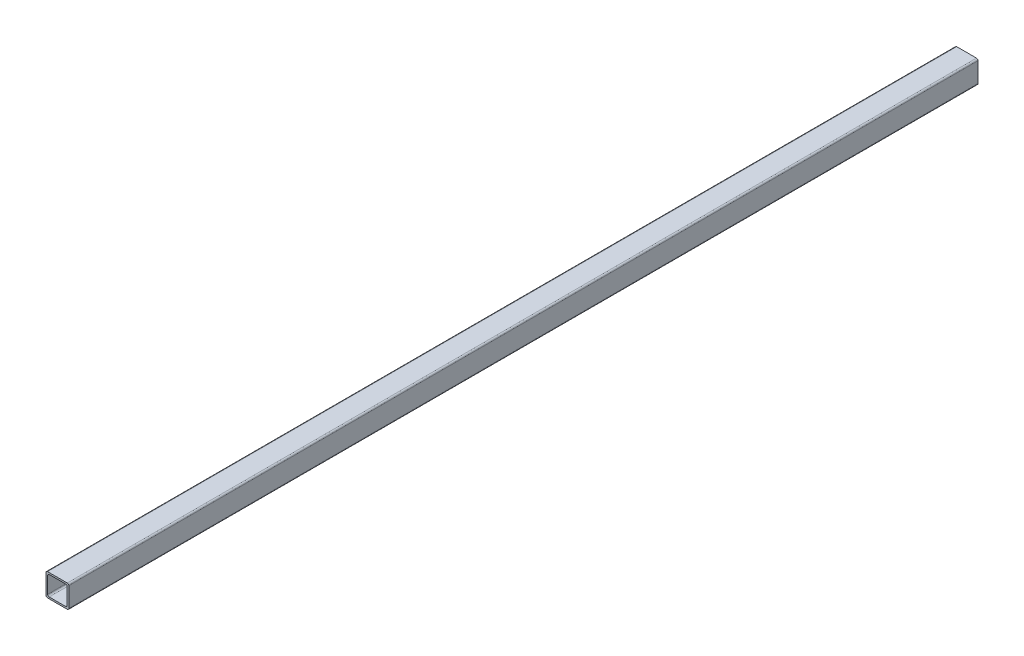
ISO-10303-21;
HEADER;
FILE_DESCRIPTION(('STEP AP214'),'2;1');
FILE_NAME('part.step','',(''),(''),'','','');
FILE_SCHEMA(('AUTOMOTIVE_DESIGN { 1 0 10303 214 1 1 1 1 }'));
ENDSEC;
DATA;
#1=APPLICATION_CONTEXT('core data for automotive mechanical design processes');
#2=APPLICATION_PROTOCOL_DEFINITION('international standard','automotive_design',2000,#1);
#3=PRODUCT_CONTEXT('',#1,'mechanical');
#4=PRODUCT('Part','Part','',(#3));
#5=PRODUCT_RELATED_PRODUCT_CATEGORY('part','',(#4));
#6=PRODUCT_DEFINITION_FORMATION('','',#4);
#7=PRODUCT_DEFINITION_CONTEXT('part definition',#1,'design');
#8=PRODUCT_DEFINITION('design','',#6,#7);
#9=PRODUCT_DEFINITION_SHAPE('','',#8);
#10=(LENGTH_UNIT() NAMED_UNIT(*) SI_UNIT(.MILLI.,.METRE.));
#11=(NAMED_UNIT(*) PLANE_ANGLE_UNIT() SI_UNIT($,.RADIAN.));
#12=(NAMED_UNIT(*) SI_UNIT($,.STERADIAN.) SOLID_ANGLE_UNIT());
#13=UNCERTAINTY_MEASURE_WITH_UNIT(LENGTH_MEASURE(1.E-05),#10,'distance_accuracy_value','');
#14=(GEOMETRIC_REPRESENTATION_CONTEXT(3) GLOBAL_UNCERTAINTY_ASSIGNED_CONTEXT((#13)) GLOBAL_UNIT_ASSIGNED_CONTEXT((#10,
#11,#12)) REPRESENTATION_CONTEXT('',''));
#15=CARTESIAN_POINT('',(0.,0.,0.));
#16=DIRECTION('',(0.,0.,1.));
#17=DIRECTION('',(1.,0.,0.));
#18=AXIS2_PLACEMENT_3D('',#15,#16,#17);
#19=CARTESIAN_POINT('',(2.54,-35.56,1520.));
#20=DIRECTION('',(0.,0.,1.));
#21=DIRECTION('',(1.,0.,0.));
#22=AXIS2_PLACEMENT_3D('',#19,#20,#21);
#23=PLANE('',#22);
#24=CARTESIAN_POINT('',(2.54,-35.56,1520.));
#25=DIRECTION('',(0.,0.,1.));
#26=DIRECTION('',(1.,0.,0.));
#27=AXIS2_PLACEMENT_3D('',#24,#25,#26);
#28=CIRCLE('',#27,2.54);
#29=CARTESIAN_POINT('',(0.,-35.56,1520.));
#30=VERTEX_POINT('',#29);
#31=CARTESIAN_POINT('',(2.54000000000002,-38.1,1520.));
#32=VERTEX_POINT('',#31);
#33=EDGE_CURVE('E211',#30,#32,#28,.T.);
#34=ORIENTED_EDGE('',*,*,#33,.T.);
#35=DIRECTION('',(1.,0.,0.));
#36=VECTOR('',#35,1.);
#37=CARTESIAN_POINT('',(2.54000000000002,-38.1,1520.));
#38=LINE('',#37,#36);
#39=CARTESIAN_POINT('',(35.56,-38.1,1520.));
#40=VERTEX_POINT('',#39);
#41=EDGE_CURVE('E214',#32,#40,#38,.T.);
#42=ORIENTED_EDGE('',*,*,#41,.T.);
#43=CARTESIAN_POINT('',(35.56,-35.56,1520.));
#44=DIRECTION('',(0.,0.,1.));
#45=DIRECTION('',(-1.,0.,0.));
#46=AXIS2_PLACEMENT_3D('',#43,#44,#45);
#47=CIRCLE('',#46,2.54);
#48=CARTESIAN_POINT('',(38.1,-35.56,1520.));
#49=VERTEX_POINT('',#48);
#50=EDGE_CURVE('E217',#40,#49,#47,.T.);
#51=ORIENTED_EDGE('',*,*,#50,.T.);
#52=DIRECTION('',(0.,1.,0.));
#53=VECTOR('',#52,1.);
#54=CARTESIAN_POINT('',(38.1,-2.54000000000002,1520.));
#55=LINE('',#54,#53);
#56=CARTESIAN_POINT('',(38.1,-2.54000000000002,1520.));
#57=VERTEX_POINT('',#56);
#58=EDGE_CURVE('E219',#49,#57,#55,.T.);
#59=ORIENTED_EDGE('',*,*,#58,.T.);
#60=CARTESIAN_POINT('',(35.56,-2.54,1520.));
#61=DIRECTION('',(0.,0.,1.));
#62=DIRECTION('',(1.,0.,0.));
#63=AXIS2_PLACEMENT_3D('',#60,#61,#62);
#64=CIRCLE('',#63,2.54);
#65=CARTESIAN_POINT('',(35.56,0.,1520.));
#66=VERTEX_POINT('',#65);
#67=EDGE_CURVE('E221',#57,#66,#64,.T.);
#68=ORIENTED_EDGE('',*,*,#67,.T.);
#69=DIRECTION('',(-1.,0.,0.));
#70=VECTOR('',#69,1.);
#71=CARTESIAN_POINT('',(2.54000000000002,0.,1520.));
#72=LINE('',#71,#70);
#73=CARTESIAN_POINT('',(2.54000000000002,0.,1520.));
#74=VERTEX_POINT('',#73);
#75=EDGE_CURVE('E223',#66,#74,#72,.T.);
#76=ORIENTED_EDGE('',*,*,#75,.T.);
#77=CARTESIAN_POINT('',(2.54,-2.54,1520.));
#78=DIRECTION('',(0.,0.,1.));
#79=DIRECTION('',(-1.,0.,0.));
#80=AXIS2_PLACEMENT_3D('',#77,#78,#79);
#81=CIRCLE('',#80,2.54);
#82=CARTESIAN_POINT('',(0.,-2.54000000000002,1520.));
#83=VERTEX_POINT('',#82);
#84=EDGE_CURVE('E225',#74,#83,#81,.T.);
#85=ORIENTED_EDGE('',*,*,#84,.T.);
#86=DIRECTION('',(0.,-1.,0.));
#87=VECTOR('',#86,1.);
#88=CARTESIAN_POINT('',(0.,-2.54000000000002,1520.));
#89=LINE('',#88,#87);
#90=EDGE_CURVE('E227',#83,#30,#89,.T.);
#91=ORIENTED_EDGE('',*,*,#90,.T.);
#92=EDGE_LOOP('',(#34,#42,#51,#59,#68,#76,#85,#91));
#93=FACE_BOUND('',#92,.T.);
#94=DIRECTION('',(1.,0.,0.));
#95=VECTOR('',#94,1.);
#96=CARTESIAN_POINT('',(5.30860000000002,-35.3314,1520.));
#97=LINE('',#96,#95);
#98=CARTESIAN_POINT('',(5.30860000000002,-35.3314,1520.));
#99=VERTEX_POINT('',#98);
#100=CARTESIAN_POINT('',(32.7914,-35.3314,1520.));
#101=VERTEX_POINT('',#100);
#102=EDGE_CURVE('E154',#99,#101,#97,.T.);
#103=ORIENTED_EDGE('',*,*,#102,.F.);
#104=CARTESIAN_POINT('',(5.3086,-32.7914,1520.));
#105=DIRECTION('',(0.,0.,1.));
#106=DIRECTION('',(1.,0.,0.));
#107=AXIS2_PLACEMENT_3D('',#104,#105,#106);
#108=CIRCLE('',#107,2.54);
#109=CARTESIAN_POINT('',(2.7686,-32.7914,1520.));
#110=VERTEX_POINT('',#109);
#111=EDGE_CURVE('E146',#110,#99,#108,.T.);
#112=ORIENTED_EDGE('',*,*,#111,.F.);
#113=DIRECTION('',(0.,-1.,0.));
#114=VECTOR('',#113,1.);
#115=CARTESIAN_POINT('',(2.7686,-5.30860000000002,1520.));
#116=LINE('',#115,#114);
#117=CARTESIAN_POINT('',(2.7686,-5.30860000000002,1520.));
#118=VERTEX_POINT('',#117);
#119=EDGE_CURVE('E179',#118,#110,#116,.T.);
#120=ORIENTED_EDGE('',*,*,#119,.F.);
#121=CARTESIAN_POINT('',(5.3086,-5.3086,1520.));
#122=DIRECTION('',(0.,0.,1.));
#123=DIRECTION('',(1.,0.,0.));
#124=AXIS2_PLACEMENT_3D('',#121,#122,#123);
#125=CIRCLE('',#124,2.54);
#126=CARTESIAN_POINT('',(5.30860000000002,-2.7686,1520.));
#127=VERTEX_POINT('',#126);
#128=EDGE_CURVE('E177',#127,#118,#125,.T.);
#129=ORIENTED_EDGE('',*,*,#128,.F.);
#130=DIRECTION('',(-1.,0.,0.));
#131=VECTOR('',#130,1.);
#132=CARTESIAN_POINT('',(5.30860000000002,-2.7686,1520.));
#133=LINE('',#132,#131);
#134=CARTESIAN_POINT('',(32.7914,-2.7686,1520.));
#135=VERTEX_POINT('',#134);
#136=EDGE_CURVE('E175',#135,#127,#133,.T.);
#137=ORIENTED_EDGE('',*,*,#136,.F.);
#138=CARTESIAN_POINT('',(32.7914,-5.3086,1520.));
#139=DIRECTION('',(0.,0.,1.));
#140=DIRECTION('',(1.,0.,0.));
#141=AXIS2_PLACEMENT_3D('',#138,#139,#140);
#142=CIRCLE('',#141,2.54);
#143=CARTESIAN_POINT('',(35.3314,-5.30860000000002,1520.));
#144=VERTEX_POINT('',#143);
#145=EDGE_CURVE('E173',#144,#135,#142,.T.);
#146=ORIENTED_EDGE('',*,*,#145,.F.);
#147=DIRECTION('',(0.,1.,0.));
#148=VECTOR('',#147,1.);
#149=CARTESIAN_POINT('',(35.3314,-5.30860000000002,1520.));
#150=LINE('',#149,#148);
#151=CARTESIAN_POINT('',(35.3314,-32.7914,1520.));
#152=VERTEX_POINT('',#151);
#153=EDGE_CURVE('E169',#152,#144,#150,.T.);
#154=ORIENTED_EDGE('',*,*,#153,.F.);
#155=CARTESIAN_POINT('',(32.7914,-32.7914,1520.));
#156=DIRECTION('',(0.,0.,1.));
#157=DIRECTION('',(1.,0.,0.));
#158=AXIS2_PLACEMENT_3D('',#155,#156,#157);
#159=CIRCLE('',#158,2.54);
#160=EDGE_CURVE('E167',#101,#152,#159,.T.);
#161=ORIENTED_EDGE('',*,*,#160,.F.);
#162=EDGE_LOOP('',(#103,#112,#120,#129,#137,#146,#154,#161));
#163=FACE_BOUND('',#162,.T.);
#164=ADVANCED_FACE('F33',(#93,#163),#23,.T.);
#165=CARTESIAN_POINT('',(2.54,-35.56,0.));
#166=DIRECTION('',(0.,0.,1.));
#167=DIRECTION('',(1.,0.,0.));
#168=AXIS2_PLACEMENT_3D('',#165,#166,#167);
#169=PLANE('',#168);
#170=CARTESIAN_POINT('',(2.54,-35.56,0.));
#171=DIRECTION('',(0.,0.,1.));
#172=DIRECTION('',(1.,0.,0.));
#173=AXIS2_PLACEMENT_3D('',#170,#171,#172);
#174=CIRCLE('',#173,2.54);
#175=CARTESIAN_POINT('',(0.,-35.56,0.));
#176=VERTEX_POINT('',#175);
#177=CARTESIAN_POINT('',(2.54000000000002,-38.1,0.));
#178=VERTEX_POINT('',#177);
#179=EDGE_CURVE('E162',#176,#178,#174,.T.);
#180=ORIENTED_EDGE('',*,*,#179,.F.);
#181=DIRECTION('',(0.,-1.,0.));
#182=VECTOR('',#181,1.);
#183=CARTESIAN_POINT('',(0.,-2.54000000000002,0.));
#184=LINE('',#183,#182);
#185=CARTESIAN_POINT('',(0.,-2.54000000000002,0.));
#186=VERTEX_POINT('',#185);
#187=EDGE_CURVE('E215',#186,#176,#184,.T.);
#188=ORIENTED_EDGE('',*,*,#187,.F.);
#189=CARTESIAN_POINT('',(2.54,-2.54,0.));
#190=DIRECTION('',(0.,0.,1.));
#191=DIRECTION('',(-1.,0.,0.));
#192=AXIS2_PLACEMENT_3D('',#189,#190,#191);
#193=CIRCLE('',#192,2.54);
#194=CARTESIAN_POINT('',(2.54000000000002,0.,0.));
#195=VERTEX_POINT('',#194);
#196=EDGE_CURVE('E242',#195,#186,#193,.T.);
#197=ORIENTED_EDGE('',*,*,#196,.F.);
#198=DIRECTION('',(-1.,0.,0.));
#199=VECTOR('',#198,1.);
#200=CARTESIAN_POINT('',(2.54000000000002,0.,0.));
#201=LINE('',#200,#199);
#202=CARTESIAN_POINT('',(35.56,0.,0.));
#203=VERTEX_POINT('',#202);
#204=EDGE_CURVE('E240',#203,#195,#201,.T.);
#205=ORIENTED_EDGE('',*,*,#204,.F.);
#206=CARTESIAN_POINT('',(35.56,-2.54,0.));
#207=DIRECTION('',(0.,0.,1.));
#208=DIRECTION('',(1.,0.,0.));
#209=AXIS2_PLACEMENT_3D('',#206,#207,#208);
#210=CIRCLE('',#209,2.54);
#211=CARTESIAN_POINT('',(38.1,-2.54000000000002,0.));
#212=VERTEX_POINT('',#211);
#213=EDGE_CURVE('E238',#212,#203,#210,.T.);
#214=ORIENTED_EDGE('',*,*,#213,.F.);
#215=DIRECTION('',(0.,1.,0.));
#216=VECTOR('',#215,1.);
#217=CARTESIAN_POINT('',(38.1,-2.54000000000002,0.));
#218=LINE('',#217,#216);
#219=CARTESIAN_POINT('',(38.1,-35.56,0.));
#220=VERTEX_POINT('',#219);
#221=EDGE_CURVE('E236',#220,#212,#218,.T.);
#222=ORIENTED_EDGE('',*,*,#221,.F.);
#223=CARTESIAN_POINT('',(35.56,-35.56,0.));
#224=DIRECTION('',(0.,0.,1.));
#225=DIRECTION('',(-1.,0.,0.));
#226=AXIS2_PLACEMENT_3D('',#223,#224,#225);
#227=CIRCLE('',#226,2.54);
#228=CARTESIAN_POINT('',(35.56,-38.1,0.));
#229=VERTEX_POINT('',#228);
#230=EDGE_CURVE('E234',#229,#220,#227,.T.);
#231=ORIENTED_EDGE('',*,*,#230,.F.);
#232=DIRECTION('',(1.,0.,0.));
#233=VECTOR('',#232,1.);
#234=CARTESIAN_POINT('',(2.54000000000002,-38.1,0.));
#235=LINE('',#234,#233);
#236=EDGE_CURVE('E232',#178,#229,#235,.T.);
#237=ORIENTED_EDGE('',*,*,#236,.F.);
#238=EDGE_LOOP('',(#180,#188,#197,#205,#214,#222,#231,#237));
#239=FACE_BOUND('',#238,.T.);
#240=CARTESIAN_POINT('',(5.3086,-32.7914,0.));
#241=DIRECTION('',(0.,0.,1.));
#242=DIRECTION('',(1.,0.,0.));
#243=AXIS2_PLACEMENT_3D('',#240,#241,#242);
#244=CIRCLE('',#243,2.54);
#245=CARTESIAN_POINT('',(2.7686,-32.7914,0.));
#246=VERTEX_POINT('',#245);
#247=CARTESIAN_POINT('',(5.30860000000002,-35.3314,0.));
#248=VERTEX_POINT('',#247);
#249=EDGE_CURVE('E56',#246,#248,#244,.T.);
#250=ORIENTED_EDGE('',*,*,#249,.T.);
#251=DIRECTION('',(1.,0.,0.));
#252=VECTOR('',#251,1.);
#253=CARTESIAN_POINT('',(5.30860000000002,-35.3314,0.));
#254=LINE('',#253,#252);
#255=CARTESIAN_POINT('',(32.7914,-35.3314,0.));
#256=VERTEX_POINT('',#255);
#257=EDGE_CURVE('E161',#248,#256,#254,.T.);
#258=ORIENTED_EDGE('',*,*,#257,.T.);
#259=CARTESIAN_POINT('',(32.7914,-32.7914,0.));
#260=DIRECTION('',(0.,0.,1.));
#261=DIRECTION('',(1.,0.,0.));
#262=AXIS2_PLACEMENT_3D('',#259,#260,#261);
#263=CIRCLE('',#262,2.54);
#264=CARTESIAN_POINT('',(35.3314,-32.7914,0.));
#265=VERTEX_POINT('',#264);
#266=EDGE_CURVE('E183',#256,#265,#263,.T.);
#267=ORIENTED_EDGE('',*,*,#266,.T.);
#268=DIRECTION('',(0.,1.,0.));
#269=VECTOR('',#268,1.);
#270=CARTESIAN_POINT('',(35.3314,-5.30860000000002,0.));
#271=LINE('',#270,#269);
#272=CARTESIAN_POINT('',(35.3314,-5.30860000000002,0.));
#273=VERTEX_POINT('',#272);
#274=EDGE_CURVE('E186',#265,#273,#271,.T.);
#275=ORIENTED_EDGE('',*,*,#274,.T.);
#276=CARTESIAN_POINT('',(32.7914,-5.3086,0.));
#277=DIRECTION('',(0.,0.,1.));
#278=DIRECTION('',(1.,0.,0.));
#279=AXIS2_PLACEMENT_3D('',#276,#277,#278);
#280=CIRCLE('',#279,2.54);
#281=CARTESIAN_POINT('',(32.7914,-2.7686,0.));
#282=VERTEX_POINT('',#281);
#283=EDGE_CURVE('E189',#273,#282,#280,.T.);
#284=ORIENTED_EDGE('',*,*,#283,.T.);
#285=DIRECTION('',(-1.,0.,0.));
#286=VECTOR('',#285,1.);
#287=CARTESIAN_POINT('',(5.30860000000002,-2.7686,0.));
#288=LINE('',#287,#286);
#289=CARTESIAN_POINT('',(5.30860000000002,-2.7686,0.));
#290=VERTEX_POINT('',#289);
#291=EDGE_CURVE('E192',#282,#290,#288,.T.);
#292=ORIENTED_EDGE('',*,*,#291,.T.);
#293=CARTESIAN_POINT('',(5.3086,-5.3086,0.));
#294=DIRECTION('',(0.,0.,1.));
#295=DIRECTION('',(1.,0.,0.));
#296=AXIS2_PLACEMENT_3D('',#293,#294,#295);
#297=CIRCLE('',#296,2.54);
#298=CARTESIAN_POINT('',(2.7686,-5.30860000000002,0.));
#299=VERTEX_POINT('',#298);
#300=EDGE_CURVE('E195',#290,#299,#297,.T.);
#301=ORIENTED_EDGE('',*,*,#300,.T.);
#302=DIRECTION('',(0.,-1.,0.));
#303=VECTOR('',#302,1.);
#304=CARTESIAN_POINT('',(2.7686,-5.30860000000002,0.));
#305=LINE('',#304,#303);
#306=EDGE_CURVE('E155',#299,#246,#305,.T.);
#307=ORIENTED_EDGE('',*,*,#306,.T.);
#308=EDGE_LOOP('',(#250,#258,#267,#275,#284,#292,#301,#307));
#309=FACE_BOUND('',#308,.T.);
#310=ADVANCED_FACE('F272',(#239,#309),#169,.F.);
#311=CARTESIAN_POINT('',(2.54,-35.56,1520.));
#312=DIRECTION('',(0.,0.,-1.));
#313=DIRECTION('',(-1.,0.,0.));
#314=AXIS2_PLACEMENT_3D('',#311,#312,#313);
#315=CYLINDRICAL_SURFACE('',#314,2.54);
#316=ORIENTED_EDGE('',*,*,#179,.T.);
#317=DIRECTION('',(0.,0.,-1.));
#318=VECTOR('',#317,1.);
#319=CARTESIAN_POINT('',(2.54000000000002,-38.1,1520.));
#320=LINE('',#319,#318);
#321=EDGE_CURVE('E11',#32,#178,#320,.T.);
#322=ORIENTED_EDGE('',*,*,#321,.F.);
#323=ORIENTED_EDGE('',*,*,#33,.F.);
#324=DIRECTION('',(0.,0.,-1.));
#325=VECTOR('',#324,1.);
#326=CARTESIAN_POINT('',(0.,-35.56,1520.));
#327=LINE('',#326,#325);
#328=EDGE_CURVE('E229',#30,#176,#327,.T.);
#329=ORIENTED_EDGE('',*,*,#328,.T.);
#330=EDGE_LOOP('',(#316,#322,#323,#329));
#331=FACE_BOUND('',#330,.T.);
#332=ADVANCED_FACE('F35',(#331),#315,.T.);
#333=CARTESIAN_POINT('',(2.54000000000002,-38.1,1520.));
#334=DIRECTION('',(0.,1.,0.));
#335=DIRECTION('',(0.,0.,1.));
#336=AXIS2_PLACEMENT_3D('',#333,#334,#335);
#337=PLANE('',#336);
#338=ORIENTED_EDGE('',*,*,#236,.T.);
#339=DIRECTION('',(0.,0.,-1.));
#340=VECTOR('',#339,1.);
#341=CARTESIAN_POINT('',(35.56,-38.1,1520.));
#342=LINE('',#341,#340);
#343=EDGE_CURVE('E41',#40,#229,#342,.T.);
#344=ORIENTED_EDGE('',*,*,#343,.F.);
#345=ORIENTED_EDGE('',*,*,#41,.F.);
#346=ORIENTED_EDGE('',*,*,#321,.T.);
#347=EDGE_LOOP('',(#338,#344,#345,#346));
#348=FACE_BOUND('',#347,.T.);
#349=ADVANCED_FACE('F289',(#348),#337,.F.);
#350=CARTESIAN_POINT('',(35.56,-35.56,1520.));
#351=DIRECTION('',(0.,0.,-1.));
#352=DIRECTION('',(-1.,0.,0.));
#353=AXIS2_PLACEMENT_3D('',#350,#351,#352);
#354=CYLINDRICAL_SURFACE('',#353,2.54);
#355=ORIENTED_EDGE('',*,*,#230,.T.);
#356=DIRECTION('',(0.,0.,-1.));
#357=VECTOR('',#356,1.);
#358=CARTESIAN_POINT('',(38.1,-35.56,1520.));
#359=LINE('',#358,#357);
#360=EDGE_CURVE('E259',#49,#220,#359,.T.);
#361=ORIENTED_EDGE('',*,*,#360,.F.);
#362=ORIENTED_EDGE('',*,*,#50,.F.);
#363=ORIENTED_EDGE('',*,*,#343,.T.);
#364=EDGE_LOOP('',(#355,#361,#362,#363));
#365=FACE_BOUND('',#364,.T.);
#366=ADVANCED_FACE('F266',(#365),#354,.T.);
#367=CARTESIAN_POINT('',(38.1,-2.54000000000002,1520.));
#368=DIRECTION('',(-1.,0.,0.));
#369=DIRECTION('',(0.,-1.,0.));
#370=AXIS2_PLACEMENT_3D('',#367,#368,#369);
#371=PLANE('',#370);
#372=ORIENTED_EDGE('',*,*,#221,.T.);
#373=DIRECTION('',(0.,0.,-1.));
#374=VECTOR('',#373,1.);
#375=CARTESIAN_POINT('',(38.1,-2.54000000000002,1520.));
#376=LINE('',#375,#374);
#377=EDGE_CURVE('E256',#57,#212,#376,.T.);
#378=ORIENTED_EDGE('',*,*,#377,.F.);
#379=ORIENTED_EDGE('',*,*,#58,.F.);
#380=ORIENTED_EDGE('',*,*,#360,.T.);
#381=EDGE_LOOP('',(#372,#378,#379,#380));
#382=FACE_BOUND('',#381,.T.);
#383=ADVANCED_FACE('F278',(#382),#371,.F.);
#384=CARTESIAN_POINT('',(35.56,-2.54,1520.));
#385=DIRECTION('',(0.,0.,-1.));
#386=DIRECTION('',(-1.,0.,0.));
#387=AXIS2_PLACEMENT_3D('',#384,#385,#386);
#388=CYLINDRICAL_SURFACE('',#387,2.54);
#389=ORIENTED_EDGE('',*,*,#213,.T.);
#390=DIRECTION('',(0.,0.,-1.));
#391=VECTOR('',#390,1.);
#392=CARTESIAN_POINT('',(35.56,0.,1520.));
#393=LINE('',#392,#391);
#394=EDGE_CURVE('E253',#66,#203,#393,.T.);
#395=ORIENTED_EDGE('',*,*,#394,.F.);
#396=ORIENTED_EDGE('',*,*,#67,.F.);
#397=ORIENTED_EDGE('',*,*,#377,.T.);
#398=EDGE_LOOP('',(#389,#395,#396,#397));
#399=FACE_BOUND('',#398,.T.);
#400=ADVANCED_FACE('F282',(#399),#388,.T.);
#401=CARTESIAN_POINT('',(2.54000000000002,0.,1520.));
#402=DIRECTION('',(0.,-1.,0.));
#403=DIRECTION('',(0.,0.,-1.));
#404=AXIS2_PLACEMENT_3D('',#401,#402,#403);
#405=PLANE('',#404);
#406=ORIENTED_EDGE('',*,*,#204,.T.);
#407=DIRECTION('',(0.,0.,-1.));
#408=VECTOR('',#407,1.);
#409=CARTESIAN_POINT('',(2.54000000000002,0.,1520.));
#410=LINE('',#409,#408);
#411=EDGE_CURVE('E250',#74,#195,#410,.T.);
#412=ORIENTED_EDGE('',*,*,#411,.F.);
#413=ORIENTED_EDGE('',*,*,#75,.F.);
#414=ORIENTED_EDGE('',*,*,#394,.T.);
#415=EDGE_LOOP('',(#406,#412,#413,#414));
#416=FACE_BOUND('',#415,.T.);
#417=ADVANCED_FACE('F302',(#416),#405,.F.);
#418=CARTESIAN_POINT('',(2.54,-2.54,1520.));
#419=DIRECTION('',(0.,0.,-1.));
#420=DIRECTION('',(-1.,0.,0.));
#421=AXIS2_PLACEMENT_3D('',#418,#419,#420);
#422=CYLINDRICAL_SURFACE('',#421,2.54);
#423=ORIENTED_EDGE('',*,*,#196,.T.);
#424=DIRECTION('',(0.,0.,-1.));
#425=VECTOR('',#424,1.);
#426=CARTESIAN_POINT('',(0.,-2.54000000000002,1520.));
#427=LINE('',#426,#425);
#428=EDGE_CURVE('E247',#83,#186,#427,.T.);
#429=ORIENTED_EDGE('',*,*,#428,.F.);
#430=ORIENTED_EDGE('',*,*,#84,.F.);
#431=ORIENTED_EDGE('',*,*,#411,.T.);
#432=EDGE_LOOP('',(#423,#429,#430,#431));
#433=FACE_BOUND('',#432,.T.);
#434=ADVANCED_FACE('F300',(#433),#422,.T.);
#435=CARTESIAN_POINT('',(0.,-2.54000000000002,1520.));
#436=DIRECTION('',(1.,0.,0.));
#437=DIRECTION('',(0.,1.,0.));
#438=AXIS2_PLACEMENT_3D('',#435,#436,#437);
#439=PLANE('',#438);
#440=ORIENTED_EDGE('',*,*,#187,.T.);
#441=ORIENTED_EDGE('',*,*,#328,.F.);
#442=ORIENTED_EDGE('',*,*,#90,.F.);
#443=ORIENTED_EDGE('',*,*,#428,.T.);
#444=EDGE_LOOP('',(#440,#441,#442,#443));
#445=FACE_BOUND('',#444,.T.);
#446=ADVANCED_FACE('F295',(#445),#439,.F.);
#447=CARTESIAN_POINT('',(5.3086,-32.7914,1520.));
#448=DIRECTION('',(0.,0.,-1.));
#449=DIRECTION('',(-1.,0.,0.));
#450=AXIS2_PLACEMENT_3D('',#447,#448,#449);
#451=CYLINDRICAL_SURFACE('',#450,2.54);
#452=ORIENTED_EDGE('',*,*,#249,.F.);
#453=DIRECTION('',(0.,0.,-1.));
#454=VECTOR('',#453,1.);
#455=CARTESIAN_POINT('',(2.7686,-32.7914,1520.));
#456=LINE('',#455,#454);
#457=EDGE_CURVE('E150',#110,#246,#456,.T.);
#458=ORIENTED_EDGE('',*,*,#457,.F.);
#459=ORIENTED_EDGE('',*,*,#111,.T.);
#460=DIRECTION('',(0.,0.,-1.));
#461=VECTOR('',#460,1.);
#462=CARTESIAN_POINT('',(5.30860000000002,-35.3314,1520.));
#463=LINE('',#462,#461);
#464=EDGE_CURVE('E149',#99,#248,#463,.T.);
#465=ORIENTED_EDGE('',*,*,#464,.T.);
#466=EDGE_LOOP('',(#452,#458,#459,#465));
#467=FACE_BOUND('',#466,.T.);
#468=ADVANCED_FACE('F148',(#467),#451,.F.);
#469=CARTESIAN_POINT('',(5.30860000000002,-35.3314,1520.));
#470=DIRECTION('',(0.,1.,0.));
#471=DIRECTION('',(0.,0.,1.));
#472=AXIS2_PLACEMENT_3D('',#469,#470,#471);
#473=PLANE('',#472);
#474=ORIENTED_EDGE('',*,*,#257,.F.);
#475=ORIENTED_EDGE('',*,*,#464,.F.);
#476=ORIENTED_EDGE('',*,*,#102,.T.);
#477=DIRECTION('',(0.,0.,-1.));
#478=VECTOR('',#477,1.);
#479=CARTESIAN_POINT('',(32.7914,-35.3314,1520.));
#480=LINE('',#479,#478);
#481=EDGE_CURVE('E163',#101,#256,#480,.T.);
#482=ORIENTED_EDGE('',*,*,#481,.T.);
#483=EDGE_LOOP('',(#474,#475,#476,#482));
#484=FACE_BOUND('',#483,.T.);
#485=ADVANCED_FACE('F158',(#484),#473,.T.);
#486=CARTESIAN_POINT('',(32.7914,-32.7914,1520.));
#487=DIRECTION('',(0.,0.,-1.));
#488=DIRECTION('',(-1.,0.,0.));
#489=AXIS2_PLACEMENT_3D('',#486,#487,#488);
#490=CYLINDRICAL_SURFACE('',#489,2.54);
#491=ORIENTED_EDGE('',*,*,#266,.F.);
#492=ORIENTED_EDGE('',*,*,#481,.F.);
#493=ORIENTED_EDGE('',*,*,#160,.T.);
#494=DIRECTION('',(0.,0.,-1.));
#495=VECTOR('',#494,1.);
#496=CARTESIAN_POINT('',(35.3314,-32.7914,1520.));
#497=LINE('',#496,#495);
#498=EDGE_CURVE('E208',#152,#265,#497,.T.);
#499=ORIENTED_EDGE('',*,*,#498,.T.);
#500=EDGE_LOOP('',(#491,#492,#493,#499));
#501=FACE_BOUND('',#500,.T.);
#502=ADVANCED_FACE('F327',(#501),#490,.F.);
#503=CARTESIAN_POINT('',(35.3314,-5.30860000000002,1520.));
#504=DIRECTION('',(-1.,0.,0.));
#505=DIRECTION('',(0.,0.,1.));
#506=AXIS2_PLACEMENT_3D('',#503,#504,#505);
#507=PLANE('',#506);
#508=ORIENTED_EDGE('',*,*,#274,.F.);
#509=ORIENTED_EDGE('',*,*,#498,.F.);
#510=ORIENTED_EDGE('',*,*,#153,.T.);
#511=DIRECTION('',(0.,0.,-1.));
#512=VECTOR('',#511,1.);
#513=CARTESIAN_POINT('',(35.3314,-5.30860000000002,1520.));
#514=LINE('',#513,#512);
#515=EDGE_CURVE('E206',#144,#273,#514,.T.);
#516=ORIENTED_EDGE('',*,*,#515,.T.);
#517=EDGE_LOOP('',(#508,#509,#510,#516));
#518=FACE_BOUND('',#517,.T.);
#519=ADVANCED_FACE('F331',(#518),#507,.T.);
#520=CARTESIAN_POINT('',(32.7914,-5.3086,1520.));
#521=DIRECTION('',(0.,0.,-1.));
#522=DIRECTION('',(-1.,0.,0.));
#523=AXIS2_PLACEMENT_3D('',#520,#521,#522);
#524=CYLINDRICAL_SURFACE('',#523,2.54);
#525=ORIENTED_EDGE('',*,*,#283,.F.);
#526=ORIENTED_EDGE('',*,*,#515,.F.);
#527=ORIENTED_EDGE('',*,*,#145,.T.);
#528=DIRECTION('',(0.,0.,-1.));
#529=VECTOR('',#528,1.);
#530=CARTESIAN_POINT('',(32.7914,-2.7686,1520.));
#531=LINE('',#530,#529);
#532=EDGE_CURVE('E204',#135,#282,#531,.T.);
#533=ORIENTED_EDGE('',*,*,#532,.T.);
#534=EDGE_LOOP('',(#525,#526,#527,#533));
#535=FACE_BOUND('',#534,.T.);
#536=ADVANCED_FACE('F337',(#535),#524,.F.);
#537=CARTESIAN_POINT('',(5.30860000000002,-2.7686,1520.));
#538=DIRECTION('',(0.,-1.,0.));
#539=DIRECTION('',(0.,0.,-1.));
#540=AXIS2_PLACEMENT_3D('',#537,#538,#539);
#541=PLANE('',#540);
#542=ORIENTED_EDGE('',*,*,#291,.F.);
#543=ORIENTED_EDGE('',*,*,#532,.F.);
#544=ORIENTED_EDGE('',*,*,#136,.T.);
#545=DIRECTION('',(0.,0.,-1.));
#546=VECTOR('',#545,1.);
#547=CARTESIAN_POINT('',(5.30860000000002,-2.7686,1520.));
#548=LINE('',#547,#546);
#549=EDGE_CURVE('E202',#127,#290,#548,.T.);
#550=ORIENTED_EDGE('',*,*,#549,.T.);
#551=EDGE_LOOP('',(#542,#543,#544,#550));
#552=FACE_BOUND('',#551,.T.);
#553=ADVANCED_FACE('F341',(#552),#541,.T.);
#554=CARTESIAN_POINT('',(5.3086,-5.3086,1520.));
#555=DIRECTION('',(0.,0.,-1.));
#556=DIRECTION('',(-1.,0.,0.));
#557=AXIS2_PLACEMENT_3D('',#554,#555,#556);
#558=CYLINDRICAL_SURFACE('',#557,2.54);
#559=ORIENTED_EDGE('',*,*,#300,.F.);
#560=ORIENTED_EDGE('',*,*,#549,.F.);
#561=ORIENTED_EDGE('',*,*,#128,.T.);
#562=DIRECTION('',(0.,0.,-1.));
#563=VECTOR('',#562,1.);
#564=CARTESIAN_POINT('',(2.7686,-5.30860000000002,1520.));
#565=LINE('',#564,#563);
#566=EDGE_CURVE('E48',#118,#299,#565,.T.);
#567=ORIENTED_EDGE('',*,*,#566,.T.);
#568=EDGE_LOOP('',(#559,#560,#561,#567));
#569=FACE_BOUND('',#568,.T.);
#570=ADVANCED_FACE('F345',(#569),#558,.F.);
#571=CARTESIAN_POINT('',(2.7686,-5.30860000000002,1520.));
#572=DIRECTION('',(1.,0.,0.));
#573=DIRECTION('',(0.,0.,-1.));
#574=AXIS2_PLACEMENT_3D('',#571,#572,#573);
#575=PLANE('',#574);
#576=ORIENTED_EDGE('',*,*,#306,.F.);
#577=ORIENTED_EDGE('',*,*,#566,.F.);
#578=ORIENTED_EDGE('',*,*,#119,.T.);
#579=ORIENTED_EDGE('',*,*,#457,.T.);
#580=EDGE_LOOP('',(#576,#577,#578,#579));
#581=FACE_BOUND('',#580,.T.);
#582=ADVANCED_FACE('F349',(#581),#575,.T.);
#583=CLOSED_SHELL('',(#164,#310,#332,#349,#366,#383,#400,#417,#434,#446,#468,#485,#502,#519,
#536,#553,#570,#582));
#584=MANIFOLD_SOLID_BREP('B2',#583);
#585=ADVANCED_BREP_SHAPE_REPRESENTATION('',(#18,#584),#14);
#586=SHAPE_DEFINITION_REPRESENTATION(#9,#585);
ENDSEC;
END-ISO-10303-21;
